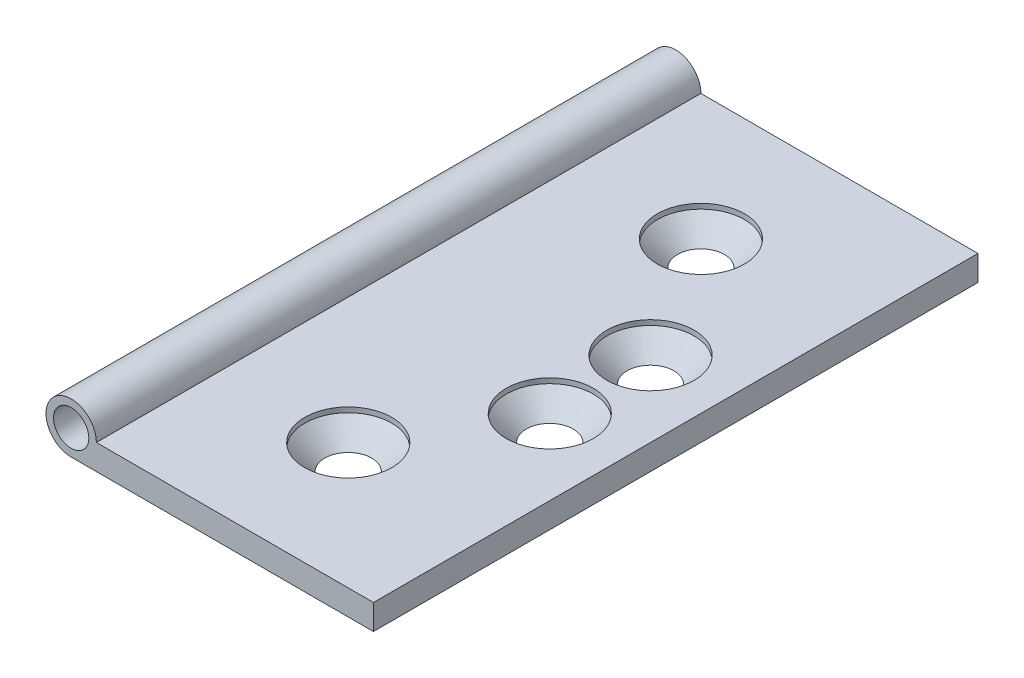
ISO-10303-21;
HEADER;
FILE_DESCRIPTION(('STEP AP214'),'2;1');
FILE_NAME('part.step','',(''),(''),'','','');
FILE_SCHEMA(('AUTOMOTIVE_DESIGN { 1 0 10303 214 1 1 1 1 }'));
ENDSEC;
DATA;
#1=APPLICATION_CONTEXT('core data for automotive mechanical design processes');
#2=APPLICATION_PROTOCOL_DEFINITION('international standard','automotive_design',2000,#1);
#3=PRODUCT_CONTEXT('',#1,'mechanical');
#4=PRODUCT('Part','Part','',(#3));
#5=PRODUCT_RELATED_PRODUCT_CATEGORY('part','',(#4));
#6=PRODUCT_DEFINITION_FORMATION('','',#4);
#7=PRODUCT_DEFINITION_CONTEXT('part definition',#1,'design');
#8=PRODUCT_DEFINITION('design','',#6,#7);
#9=PRODUCT_DEFINITION_SHAPE('','',#8);
#10=(LENGTH_UNIT() NAMED_UNIT(*) SI_UNIT(.MILLI.,.METRE.));
#11=(NAMED_UNIT(*) PLANE_ANGLE_UNIT() SI_UNIT($,.RADIAN.));
#12=(NAMED_UNIT(*) SI_UNIT($,.STERADIAN.) SOLID_ANGLE_UNIT());
#13=UNCERTAINTY_MEASURE_WITH_UNIT(LENGTH_MEASURE(1.E-05),#10,'distance_accuracy_value','');
#14=(GEOMETRIC_REPRESENTATION_CONTEXT(3) GLOBAL_UNCERTAINTY_ASSIGNED_CONTEXT((#13)) GLOBAL_UNIT_ASSIGNED_CONTEXT((#10,
#11,#12)) REPRESENTATION_CONTEXT('',''));
#15=CARTESIAN_POINT('',(0.,0.,0.));
#16=DIRECTION('',(0.,0.,1.));
#17=DIRECTION('',(1.,0.,0.));
#18=AXIS2_PLACEMENT_3D('',#15,#16,#17);
#19=CARTESIAN_POINT('',(0.,-5.,60.));
#20=DIRECTION('',(0.,1.,0.));
#21=DIRECTION('',(0.,0.,1.));
#22=AXIS2_PLACEMENT_3D('',#19,#20,#21);
#23=PLANE('',#22);
#24=CARTESIAN_POINT('',(30.,-5.,-35.));
#25=DIRECTION('',(0.,1.,0.));
#26=DIRECTION('',(0.,0.,1.));
#27=AXIS2_PLACEMENT_3D('',#24,#25,#26);
#28=CIRCLE('',#27,4.65);
#29=CARTESIAN_POINT('',(30.,-5.,-30.35));
#30=VERTEX_POINT('',#29);
#31=EDGE_CURVE('E46',#30,#30,#28,.T.);
#32=ORIENTED_EDGE('',*,*,#31,.T.);
#33=EDGE_LOOP('',(#32));
#34=FACE_BOUND('',#33,.T.);
#35=CARTESIAN_POINT('',(45.,-5.,-9.99999999999999));
#36=DIRECTION('',(0.,1.,0.));
#37=DIRECTION('',(0.,0.,1.));
#38=AXIS2_PLACEMENT_3D('',#35,#36,#37);
#39=CIRCLE('',#38,4.65);
#40=CARTESIAN_POINT('',(45.,-5.,-5.35));
#41=VERTEX_POINT('',#40);
#42=EDGE_CURVE('E121',#41,#41,#39,.T.);
#43=ORIENTED_EDGE('',*,*,#42,.T.);
#44=EDGE_LOOP('',(#43));
#45=FACE_BOUND('',#44,.T.);
#46=CARTESIAN_POINT('',(30.,-5.,35.));
#47=DIRECTION('',(0.,1.,0.));
#48=DIRECTION('',(0.,0.,1.));
#49=AXIS2_PLACEMENT_3D('',#46,#47,#48);
#50=CIRCLE('',#49,4.65);
#51=CARTESIAN_POINT('',(30.,-5.,39.65));
#52=VERTEX_POINT('',#51);
#53=EDGE_CURVE('E117',#52,#52,#50,.T.);
#54=ORIENTED_EDGE('',*,*,#53,.T.);
#55=EDGE_LOOP('',(#54));
#56=FACE_BOUND('',#55,.T.);
#57=CARTESIAN_POINT('',(45.,-5.,9.99999999999999));
#58=DIRECTION('',(0.,1.,0.));
#59=DIRECTION('',(0.,0.,1.));
#60=AXIS2_PLACEMENT_3D('',#57,#58,#59);
#61=CIRCLE('',#60,4.65);
#62=CARTESIAN_POINT('',(45.,-5.,14.65));
#63=VERTEX_POINT('',#62);
#64=EDGE_CURVE('E112',#63,#63,#61,.T.);
#65=ORIENTED_EDGE('',*,*,#64,.T.);
#66=EDGE_LOOP('',(#65));
#67=FACE_BOUND('',#66,.T.);
#68=DIRECTION('',(1.,0.,0.));
#69=VECTOR('',#68,1.);
#70=CARTESIAN_POINT('',(0.,-5.,-60.));
#71=LINE('',#70,#69);
#72=CARTESIAN_POINT('',(0.,-5.,-60.));
#73=VERTEX_POINT('',#72);
#74=CARTESIAN_POINT('',(60.,-5.,-60.));
#75=VERTEX_POINT('',#74);
#76=EDGE_CURVE('E94',#73,#75,#71,.T.);
#77=ORIENTED_EDGE('',*,*,#76,.T.);
#78=DIRECTION('',(0.,0.,-1.));
#79=VECTOR('',#78,1.);
#80=CARTESIAN_POINT('',(60.,-5.,60.));
#81=LINE('',#80,#79);
#82=CARTESIAN_POINT('',(60.,-5.,60.));
#83=VERTEX_POINT('',#82);
#84=EDGE_CURVE('E11',#83,#75,#81,.T.);
#85=ORIENTED_EDGE('',*,*,#84,.F.);
#86=DIRECTION('',(1.,0.,0.));
#87=VECTOR('',#86,1.);
#88=CARTESIAN_POINT('',(0.,-5.,60.));
#89=LINE('',#88,#87);
#90=CARTESIAN_POINT('',(0.,-5.,60.));
#91=VERTEX_POINT('',#90);
#92=EDGE_CURVE('E82',#91,#83,#89,.T.);
#93=ORIENTED_EDGE('',*,*,#92,.F.);
#94=DIRECTION('',(0.,0.,-1.));
#95=VECTOR('',#94,1.);
#96=CARTESIAN_POINT('',(0.,-5.,60.));
#97=LINE('',#96,#95);
#98=EDGE_CURVE('E102',#91,#73,#97,.T.);
#99=ORIENTED_EDGE('',*,*,#98,.T.);
#100=EDGE_LOOP('',(#77,#85,#93,#99));
#101=FACE_BOUND('',#100,.T.);
#102=ADVANCED_FACE('F43',(#34,#45,#56,#67,#101),#23,.F.);
#103=CARTESIAN_POINT('',(60.,0.,60.));
#104=DIRECTION('',(1.,0.,0.));
#105=DIRECTION('',(0.,0.,-1.));
#106=AXIS2_PLACEMENT_3D('',#103,#104,#105);
#107=PLANE('',#106);
#108=DIRECTION('',(0.,-1.,0.));
#109=VECTOR('',#108,1.);
#110=CARTESIAN_POINT('',(60.,0.,-60.));
#111=LINE('',#110,#109);
#112=CARTESIAN_POINT('',(60.,0.,-60.));
#113=VERTEX_POINT('',#112);
#114=EDGE_CURVE('E107',#113,#75,#111,.T.);
#115=ORIENTED_EDGE('',*,*,#114,.F.);
#116=DIRECTION('',(0.,0.,-1.));
#117=VECTOR('',#116,1.);
#118=CARTESIAN_POINT('',(60.,0.,60.));
#119=LINE('',#118,#117);
#120=CARTESIAN_POINT('',(60.,0.,60.));
#121=VERTEX_POINT('',#120);
#122=EDGE_CURVE('E51',#121,#113,#119,.T.);
#123=ORIENTED_EDGE('',*,*,#122,.F.);
#124=DIRECTION('',(0.,-1.,0.));
#125=VECTOR('',#124,1.);
#126=CARTESIAN_POINT('',(60.,0.,60.));
#127=LINE('',#126,#125);
#128=EDGE_CURVE('E86',#121,#83,#127,.T.);
#129=ORIENTED_EDGE('',*,*,#128,.T.);
#130=ORIENTED_EDGE('',*,*,#84,.T.);
#131=EDGE_LOOP('',(#115,#123,#129,#130));
#132=FACE_BOUND('',#131,.T.);
#133=ADVANCED_FACE('F99',(#132),#107,.T.);
#134=CARTESIAN_POINT('',(0.,0.,60.));
#135=DIRECTION('',(0.,1.,0.));
#136=DIRECTION('',(0.,0.,1.));
#137=AXIS2_PLACEMENT_3D('',#134,#135,#136);
#138=PLANE('',#137);
#139=CARTESIAN_POINT('',(30.,0.,-35.));
#140=DIRECTION('',(0.,1.,0.));
#141=DIRECTION('',(0.,0.,1.));
#142=AXIS2_PLACEMENT_3D('',#139,#140,#141);
#143=CIRCLE('',#142,8.65);
#144=CARTESIAN_POINT('',(30.,0.,-26.35));
#145=VERTEX_POINT('',#144);
#146=EDGE_CURVE('E297',#145,#145,#143,.T.);
#147=ORIENTED_EDGE('',*,*,#146,.F.);
#148=EDGE_LOOP('',(#147));
#149=FACE_BOUND('',#148,.T.);
#150=CARTESIAN_POINT('',(45.,0.,-9.99999999999999));
#151=DIRECTION('',(0.,1.,0.));
#152=DIRECTION('',(0.,0.,1.));
#153=AXIS2_PLACEMENT_3D('',#150,#151,#152);
#154=CIRCLE('',#153,8.65);
#155=CARTESIAN_POINT('',(45.,0.,-1.35));
#156=VERTEX_POINT('',#155);
#157=EDGE_CURVE('E130',#156,#156,#154,.T.);
#158=ORIENTED_EDGE('',*,*,#157,.F.);
#159=EDGE_LOOP('',(#158));
#160=FACE_BOUND('',#159,.T.);
#161=CARTESIAN_POINT('',(30.,0.,35.));
#162=DIRECTION('',(0.,1.,0.));
#163=DIRECTION('',(0.,0.,1.));
#164=AXIS2_PLACEMENT_3D('',#161,#162,#163);
#165=CIRCLE('',#164,8.65);
#166=CARTESIAN_POINT('',(30.,0.,43.65));
#167=VERTEX_POINT('',#166);
#168=EDGE_CURVE('E123',#167,#167,#165,.T.);
#169=ORIENTED_EDGE('',*,*,#168,.F.);
#170=EDGE_LOOP('',(#169));
#171=FACE_BOUND('',#170,.T.);
#172=CARTESIAN_POINT('',(45.,0.,9.99999999999999));
#173=DIRECTION('',(0.,1.,0.));
#174=DIRECTION('',(0.,0.,1.));
#175=AXIS2_PLACEMENT_3D('',#172,#173,#174);
#176=CIRCLE('',#175,8.65);
#177=CARTESIAN_POINT('',(45.,0.,18.65));
#178=VERTEX_POINT('',#177);
#179=EDGE_CURVE('E119',#178,#178,#176,.T.);
#180=ORIENTED_EDGE('',*,*,#179,.F.);
#181=EDGE_LOOP('',(#180));
#182=FACE_BOUND('',#181,.T.);
#183=DIRECTION('',(0.,0.,1.));
#184=VECTOR('',#183,1.);
#185=CARTESIAN_POINT('',(5.,0.,-60.));
#186=LINE('',#185,#184);
#187=CARTESIAN_POINT('',(5.,0.,60.));
#188=VERTEX_POINT('',#187);
#189=CARTESIAN_POINT('',(5.,0.,-60.));
#190=VERTEX_POINT('',#189);
#191=EDGE_CURVE('E59',#188,#190,#186,.F.);
#192=ORIENTED_EDGE('',*,*,#191,.F.);
#193=DIRECTION('',(1.,0.,0.));
#194=VECTOR('',#193,1.);
#195=CARTESIAN_POINT('',(0.,0.,60.));
#196=LINE('',#195,#194);
#197=EDGE_CURVE('E100',#188,#121,#196,.T.);
#198=ORIENTED_EDGE('',*,*,#197,.T.);
#199=ORIENTED_EDGE('',*,*,#122,.T.);
#200=DIRECTION('',(1.,0.,0.));
#201=VECTOR('',#200,1.);
#202=CARTESIAN_POINT('',(0.,0.,-60.));
#203=LINE('',#202,#201);
#204=EDGE_CURVE('E64',#190,#113,#203,.T.);
#205=ORIENTED_EDGE('',*,*,#204,.F.);
#206=EDGE_LOOP('',(#192,#198,#199,#205));
#207=FACE_BOUND('',#206,.T.);
#208=ADVANCED_FACE('F157',(#149,#160,#171,#182,#207),#138,.T.);
#209=CARTESIAN_POINT('',(0.,0.,60.));
#210=DIRECTION('',(0.,0.,-1.));
#211=DIRECTION('',(-1.,0.,0.));
#212=AXIS2_PLACEMENT_3D('',#209,#210,#211);
#213=PLANE('',#212);
#214=CARTESIAN_POINT('',(0.,0.,60.));
#215=DIRECTION('',(0.,0.,1.));
#216=DIRECTION('',(1.,0.,0.));
#217=AXIS2_PLACEMENT_3D('',#214,#215,#216);
#218=CIRCLE('',#217,3.5);
#219=CARTESIAN_POINT('',(3.5,0.,60.));
#220=VERTEX_POINT('',#219);
#221=EDGE_CURVE('E115',#220,#220,#218,.T.);
#222=ORIENTED_EDGE('',*,*,#221,.F.);
#223=EDGE_LOOP('',(#222));
#224=FACE_BOUND('',#223,.T.);
#225=ORIENTED_EDGE('',*,*,#197,.F.);
#226=CARTESIAN_POINT('',(0.,0.,60.));
#227=DIRECTION('',(0.,0.,1.));
#228=DIRECTION('',(1.,0.,0.));
#229=AXIS2_PLACEMENT_3D('',#226,#227,#228);
#230=CIRCLE('',#229,5.);
#231=EDGE_CURVE('E88',#188,#91,#230,.T.);
#232=ORIENTED_EDGE('',*,*,#231,.T.);
#233=ORIENTED_EDGE('',*,*,#92,.T.);
#234=ORIENTED_EDGE('',*,*,#128,.F.);
#235=EDGE_LOOP('',(#225,#232,#233,#234));
#236=FACE_BOUND('',#235,.T.);
#237=ADVANCED_FACE('F84',(#224,#236),#213,.F.);
#238=CARTESIAN_POINT('',(0.,0.,-60.));
#239=DIRECTION('',(0.,0.,-1.));
#240=DIRECTION('',(-1.,0.,0.));
#241=AXIS2_PLACEMENT_3D('',#238,#239,#240);
#242=PLANE('',#241);
#243=CARTESIAN_POINT('',(0.,0.,-60.));
#244=DIRECTION('',(0.,0.,1.));
#245=DIRECTION('',(1.,0.,0.));
#246=AXIS2_PLACEMENT_3D('',#243,#244,#245);
#247=CIRCLE('',#246,3.5);
#248=CARTESIAN_POINT('',(3.5,0.,-60.));
#249=VERTEX_POINT('',#248);
#250=EDGE_CURVE('E144',#249,#249,#247,.T.);
#251=ORIENTED_EDGE('',*,*,#250,.T.);
#252=EDGE_LOOP('',(#251));
#253=FACE_BOUND('',#252,.T.);
#254=CARTESIAN_POINT('',(0.,0.,-60.));
#255=DIRECTION('',(0.,0.,1.));
#256=DIRECTION('',(1.,0.,0.));
#257=AXIS2_PLACEMENT_3D('',#254,#255,#256);
#258=CIRCLE('',#257,5.);
#259=EDGE_CURVE('E149',#190,#73,#258,.T.);
#260=ORIENTED_EDGE('',*,*,#259,.F.);
#261=ORIENTED_EDGE('',*,*,#204,.T.);
#262=ORIENTED_EDGE('',*,*,#114,.T.);
#263=ORIENTED_EDGE('',*,*,#76,.F.);
#264=EDGE_LOOP('',(#260,#261,#262,#263));
#265=FACE_BOUND('',#264,.T.);
#266=ADVANCED_FACE('F156',(#253,#265),#242,.T.);
#267=CARTESIAN_POINT('',(0.,0.,-60.));
#268=DIRECTION('',(0.,0.,1.));
#269=DIRECTION('',(1.,0.,0.));
#270=AXIS2_PLACEMENT_3D('',#267,#268,#269);
#271=CYLINDRICAL_SURFACE('',#270,5.);
#272=ORIENTED_EDGE('',*,*,#231,.F.);
#273=ORIENTED_EDGE('',*,*,#191,.T.);
#274=ORIENTED_EDGE('',*,*,#259,.T.);
#275=ORIENTED_EDGE('',*,*,#98,.F.);
#276=EDGE_LOOP('',(#272,#273,#274,#275));
#277=FACE_BOUND('',#276,.T.);
#278=ADVANCED_FACE('F154',(#277),#271,.T.);
#279=CARTESIAN_POINT('',(0.,0.,-60.));
#280=DIRECTION('',(0.,0.,1.));
#281=DIRECTION('',(1.,0.,0.));
#282=AXIS2_PLACEMENT_3D('',#279,#280,#281);
#283=CYLINDRICAL_SURFACE('',#282,3.5);
#284=ORIENTED_EDGE('',*,*,#250,.F.);
#285=EDGE_LOOP('',(#284));
#286=FACE_BOUND('',#285,.T.);
#287=ORIENTED_EDGE('',*,*,#221,.T.);
#288=EDGE_LOOP('',(#287));
#289=FACE_BOUND('',#288,.T.);
#290=ADVANCED_FACE('F186',(#286,#289),#283,.F.);
#291=CARTESIAN_POINT('',(45.,-1.,9.99999999999999));
#292=DIRECTION('',(0.,1.,0.));
#293=DIRECTION('',(0.,0.,1.));
#294=AXIS2_PLACEMENT_3D('',#291,#292,#293);
#295=CONICAL_SURFACE('',#294,8.65,0.785398163397448);
#296=CARTESIAN_POINT('',(45.,-1.,9.99999999999999));
#297=DIRECTION('',(0.,1.,0.));
#298=DIRECTION('',(0.,0.,1.));
#299=AXIS2_PLACEMENT_3D('',#296,#297,#298);
#300=CIRCLE('',#299,8.65);
#301=CARTESIAN_POINT('',(45.,-1.,18.65));
#302=VERTEX_POINT('',#301);
#303=EDGE_CURVE('E116',#302,#302,#300,.T.);
#304=ORIENTED_EDGE('',*,*,#303,.T.);
#305=EDGE_LOOP('',(#304));
#306=FACE_BOUND('',#305,.T.);
#307=ORIENTED_EDGE('',*,*,#64,.F.);
#308=EDGE_LOOP('',(#307));
#309=FACE_BOUND('',#308,.T.);
#310=ADVANCED_FACE('F183',(#306,#309),#295,.F.);
#311=CARTESIAN_POINT('',(45.,0.,9.99999999999999));
#312=DIRECTION('',(0.,1.,0.));
#313=DIRECTION('',(0.,0.,1.));
#314=AXIS2_PLACEMENT_3D('',#311,#312,#313);
#315=CYLINDRICAL_SURFACE('',#314,8.65);
#316=ORIENTED_EDGE('',*,*,#303,.F.);
#317=EDGE_LOOP('',(#316));
#318=FACE_BOUND('',#317,.T.);
#319=ORIENTED_EDGE('',*,*,#179,.T.);
#320=EDGE_LOOP('',(#319));
#321=FACE_BOUND('',#320,.T.);
#322=ADVANCED_FACE('F185',(#318,#321),#315,.F.);
#323=CARTESIAN_POINT('',(30.,-1.,35.));
#324=DIRECTION('',(0.,1.,0.));
#325=DIRECTION('',(0.,0.,1.));
#326=AXIS2_PLACEMENT_3D('',#323,#324,#325);
#327=CONICAL_SURFACE('',#326,8.65,0.785398163397448);
#328=CARTESIAN_POINT('',(30.,-1.,35.));
#329=DIRECTION('',(0.,1.,0.));
#330=DIRECTION('',(0.,0.,1.));
#331=AXIS2_PLACEMENT_3D('',#328,#329,#330);
#332=CIRCLE('',#331,8.65);
#333=CARTESIAN_POINT('',(30.,-1.,43.65));
#334=VERTEX_POINT('',#333);
#335=EDGE_CURVE('E120',#334,#334,#332,.T.);
#336=ORIENTED_EDGE('',*,*,#335,.T.);
#337=EDGE_LOOP('',(#336));
#338=FACE_BOUND('',#337,.T.);
#339=ORIENTED_EDGE('',*,*,#53,.F.);
#340=EDGE_LOOP('',(#339));
#341=FACE_BOUND('',#340,.T.);
#342=ADVANCED_FACE('F193',(#338,#341),#327,.F.);
#343=CARTESIAN_POINT('',(30.,0.,35.));
#344=DIRECTION('',(0.,1.,0.));
#345=DIRECTION('',(0.,0.,1.));
#346=AXIS2_PLACEMENT_3D('',#343,#344,#345);
#347=CYLINDRICAL_SURFACE('',#346,8.65);
#348=ORIENTED_EDGE('',*,*,#335,.F.);
#349=EDGE_LOOP('',(#348));
#350=FACE_BOUND('',#349,.T.);
#351=ORIENTED_EDGE('',*,*,#168,.T.);
#352=EDGE_LOOP('',(#351));
#353=FACE_BOUND('',#352,.T.);
#354=ADVANCED_FACE('F243',(#350,#353),#347,.F.);
#355=CARTESIAN_POINT('',(45.,-1.,-9.99999999999999));
#356=DIRECTION('',(0.,1.,0.));
#357=DIRECTION('',(0.,0.,1.));
#358=AXIS2_PLACEMENT_3D('',#355,#356,#357);
#359=CONICAL_SURFACE('',#358,8.65,0.785398163397448);
#360=CARTESIAN_POINT('',(45.,-1.,-9.99999999999999));
#361=DIRECTION('',(0.,1.,0.));
#362=DIRECTION('',(0.,0.,1.));
#363=AXIS2_PLACEMENT_3D('',#360,#361,#362);
#364=CIRCLE('',#363,8.65);
#365=CARTESIAN_POINT('',(45.,-1.,-1.35));
#366=VERTEX_POINT('',#365);
#367=EDGE_CURVE('E124',#366,#366,#364,.T.);
#368=ORIENTED_EDGE('',*,*,#367,.T.);
#369=EDGE_LOOP('',(#368));
#370=FACE_BOUND('',#369,.T.);
#371=ORIENTED_EDGE('',*,*,#42,.F.);
#372=EDGE_LOOP('',(#371));
#373=FACE_BOUND('',#372,.T.);
#374=ADVANCED_FACE('F251',(#370,#373),#359,.F.);
#375=CARTESIAN_POINT('',(45.,0.,-9.99999999999999));
#376=DIRECTION('',(0.,1.,0.));
#377=DIRECTION('',(0.,0.,1.));
#378=AXIS2_PLACEMENT_3D('',#375,#376,#377);
#379=CYLINDRICAL_SURFACE('',#378,8.65);
#380=ORIENTED_EDGE('',*,*,#367,.F.);
#381=EDGE_LOOP('',(#380));
#382=FACE_BOUND('',#381,.T.);
#383=ORIENTED_EDGE('',*,*,#157,.T.);
#384=EDGE_LOOP('',(#383));
#385=FACE_BOUND('',#384,.T.);
#386=ADVANCED_FACE('F260',(#382,#385),#379,.F.);
#387=CARTESIAN_POINT('',(30.,-1.,-35.));
#388=DIRECTION('',(0.,1.,0.));
#389=DIRECTION('',(0.,0.,1.));
#390=AXIS2_PLACEMENT_3D('',#387,#388,#389);
#391=CONICAL_SURFACE('',#390,8.65,0.785398163397448);
#392=CARTESIAN_POINT('',(30.,-1.,-35.));
#393=DIRECTION('',(0.,1.,0.));
#394=DIRECTION('',(0.,0.,1.));
#395=AXIS2_PLACEMENT_3D('',#392,#393,#394);
#396=CIRCLE('',#395,8.65);
#397=CARTESIAN_POINT('',(30.,-1.,-26.35));
#398=VERTEX_POINT('',#397);
#399=EDGE_CURVE('E295',#398,#398,#396,.T.);
#400=ORIENTED_EDGE('',*,*,#399,.T.);
#401=EDGE_LOOP('',(#400));
#402=FACE_BOUND('',#401,.T.);
#403=ORIENTED_EDGE('',*,*,#31,.F.);
#404=EDGE_LOOP('',(#403));
#405=FACE_BOUND('',#404,.T.);
#406=ADVANCED_FACE('F269',(#402,#405),#391,.F.);
#407=CARTESIAN_POINT('',(30.,0.,-35.));
#408=DIRECTION('',(0.,1.,0.));
#409=DIRECTION('',(0.,0.,1.));
#410=AXIS2_PLACEMENT_3D('',#407,#408,#409);
#411=CYLINDRICAL_SURFACE('',#410,8.65);
#412=ORIENTED_EDGE('',*,*,#399,.F.);
#413=EDGE_LOOP('',(#412));
#414=FACE_BOUND('',#413,.T.);
#415=ORIENTED_EDGE('',*,*,#146,.T.);
#416=EDGE_LOOP('',(#415));
#417=FACE_BOUND('',#416,.T.);
#418=ADVANCED_FACE('F279',(#414,#417),#411,.F.);
#419=CLOSED_SHELL('',(#102,#133,#208,#237,#266,#278,#290,#310,#322,#342,#354,#374,#386,#406,#418));
#420=MANIFOLD_SOLID_BREP('B2',#419);
#421=ADVANCED_BREP_SHAPE_REPRESENTATION('',(#18,#420),#14);
#422=SHAPE_DEFINITION_REPRESENTATION(#9,#421);
ENDSEC;
END-ISO-10303-21;
